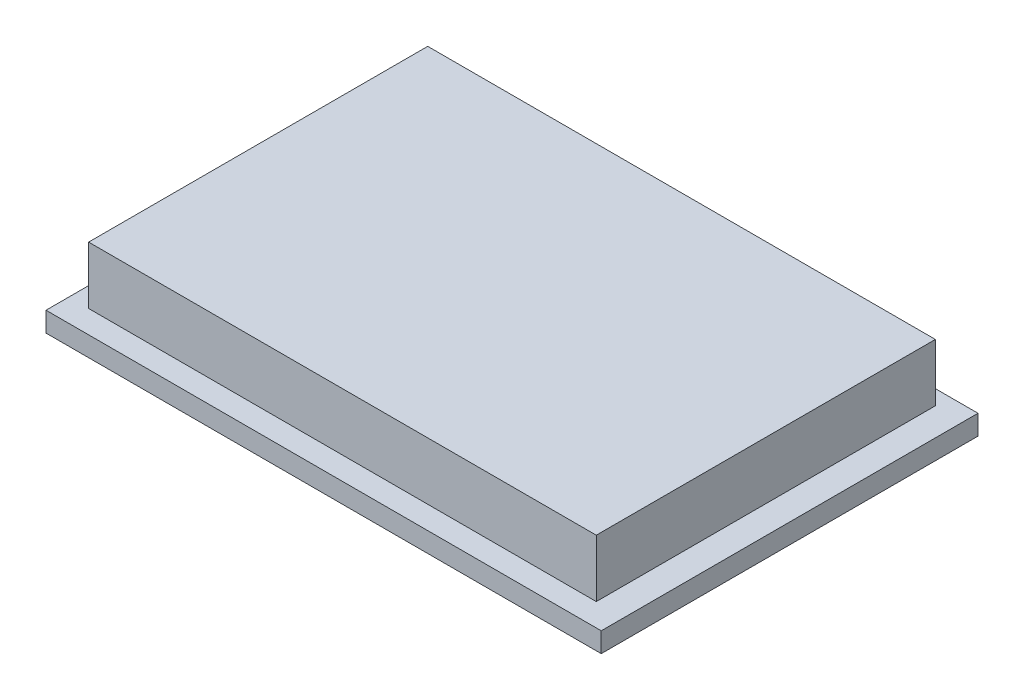
ISO-10303-21;
HEADER;
FILE_DESCRIPTION(('STEP AP214'),'2;1');
FILE_NAME('part.step','',(''),(''),'','','');
FILE_SCHEMA(('AUTOMOTIVE_DESIGN { 1 0 10303 214 1 1 1 1 }'));
ENDSEC;
DATA;
#1=APPLICATION_CONTEXT('core data for automotive mechanical design processes');
#2=APPLICATION_PROTOCOL_DEFINITION('international standard','automotive_design',2000,#1);
#3=PRODUCT_CONTEXT('',#1,'mechanical');
#4=PRODUCT('Part','Part','',(#3));
#5=PRODUCT_RELATED_PRODUCT_CATEGORY('part','',(#4));
#6=PRODUCT_DEFINITION_FORMATION('','',#4);
#7=PRODUCT_DEFINITION_CONTEXT('part definition',#1,'design');
#8=PRODUCT_DEFINITION('design','',#6,#7);
#9=PRODUCT_DEFINITION_SHAPE('','',#8);
#10=(LENGTH_UNIT() NAMED_UNIT(*) SI_UNIT(.MILLI.,.METRE.));
#11=(NAMED_UNIT(*) PLANE_ANGLE_UNIT() SI_UNIT($,.RADIAN.));
#12=(NAMED_UNIT(*) SI_UNIT($,.STERADIAN.) SOLID_ANGLE_UNIT());
#13=UNCERTAINTY_MEASURE_WITH_UNIT(LENGTH_MEASURE(1.E-05),#10,'distance_accuracy_value','');
#14=(GEOMETRIC_REPRESENTATION_CONTEXT(3) GLOBAL_UNCERTAINTY_ASSIGNED_CONTEXT((#13)) GLOBAL_UNIT_ASSIGNED_CONTEXT((#10,
#11,#12)) REPRESENTATION_CONTEXT('',''));
#15=CARTESIAN_POINT('',(0.,0.,0.));
#16=DIRECTION('',(0.,0.,1.));
#17=DIRECTION('',(1.,0.,0.));
#18=AXIS2_PLACEMENT_3D('',#15,#16,#17);
#19=CARTESIAN_POINT('',(-70.,-6.,-47.5));
#20=DIRECTION('',(1.,0.,0.));
#21=DIRECTION('',(0.,0.,-1.));
#22=AXIS2_PLACEMENT_3D('',#19,#20,#21);
#23=PLANE('',#22);
#24=DIRECTION('',(0.,0.,-1.));
#25=VECTOR('',#24,1.);
#26=CARTESIAN_POINT('',(-70.,-1.,-47.5));
#27=LINE('',#26,#25);
#28=CARTESIAN_POINT('',(-70.,-1.,47.5));
#29=VERTEX_POINT('',#28);
#30=CARTESIAN_POINT('',(-70.,-1.,-47.5));
#31=VERTEX_POINT('',#30);
#32=EDGE_CURVE('E106',#29,#31,#27,.T.);
#33=ORIENTED_EDGE('',*,*,#32,.T.);
#34=DIRECTION('',(0.,1.,0.));
#35=VECTOR('',#34,1.);
#36=CARTESIAN_POINT('',(-70.,-6.,-47.5));
#37=LINE('',#36,#35);
#38=CARTESIAN_POINT('',(-70.,-6.,-47.5));
#39=VERTEX_POINT('',#38);
#40=EDGE_CURVE('E12',#39,#31,#37,.T.);
#41=ORIENTED_EDGE('',*,*,#40,.F.);
#42=DIRECTION('',(0.,0.,-1.));
#43=VECTOR('',#42,1.);
#44=CARTESIAN_POINT('',(-70.,-6.,-47.5));
#45=LINE('',#44,#43);
#46=CARTESIAN_POINT('',(-70.,-6.,47.5));
#47=VERTEX_POINT('',#46);
#48=EDGE_CURVE('E94',#47,#39,#45,.T.);
#49=ORIENTED_EDGE('',*,*,#48,.F.);
#50=DIRECTION('',(0.,1.,0.));
#51=VECTOR('',#50,1.);
#52=CARTESIAN_POINT('',(-70.,-6.,47.5));
#53=LINE('',#52,#51);
#54=EDGE_CURVE('E102',#47,#29,#53,.T.);
#55=ORIENTED_EDGE('',*,*,#54,.T.);
#56=EDGE_LOOP('',(#33,#41,#49,#55));
#57=FACE_BOUND('',#56,.T.);
#58=ADVANCED_FACE('F43',(#57),#23,.F.);
#59=CARTESIAN_POINT('',(70.,-6.,-47.5));
#60=DIRECTION('',(0.,0.,1.));
#61=DIRECTION('',(1.,0.,0.));
#62=AXIS2_PLACEMENT_3D('',#59,#60,#61);
#63=PLANE('',#62);
#64=DIRECTION('',(1.,0.,0.));
#65=VECTOR('',#64,1.);
#66=CARTESIAN_POINT('',(70.,-1.,-47.5));
#67=LINE('',#66,#65);
#68=CARTESIAN_POINT('',(70.,-1.,-47.5));
#69=VERTEX_POINT('',#68);
#70=EDGE_CURVE('E98',#31,#69,#67,.T.);
#71=ORIENTED_EDGE('',*,*,#70,.T.);
#72=DIRECTION('',(0.,1.,0.));
#73=VECTOR('',#72,1.);
#74=CARTESIAN_POINT('',(70.,-6.,-47.5));
#75=LINE('',#74,#73);
#76=CARTESIAN_POINT('',(70.,-6.,-47.5));
#77=VERTEX_POINT('',#76);
#78=EDGE_CURVE('E51',#77,#69,#75,.T.);
#79=ORIENTED_EDGE('',*,*,#78,.F.);
#80=DIRECTION('',(1.,0.,0.));
#81=VECTOR('',#80,1.);
#82=CARTESIAN_POINT('',(70.,-6.,-47.5));
#83=LINE('',#82,#81);
#84=EDGE_CURVE('E89',#39,#77,#83,.T.);
#85=ORIENTED_EDGE('',*,*,#84,.F.);
#86=ORIENTED_EDGE('',*,*,#40,.T.);
#87=EDGE_LOOP('',(#71,#79,#85,#86));
#88=FACE_BOUND('',#87,.T.);
#89=ADVANCED_FACE('F97',(#88),#63,.F.);
#90=CARTESIAN_POINT('',(70.,-6.,-47.5));
#91=DIRECTION('',(-1.,0.,0.));
#92=DIRECTION('',(0.,0.,1.));
#93=AXIS2_PLACEMENT_3D('',#90,#91,#92);
#94=PLANE('',#93);
#95=DIRECTION('',(0.,0.,1.));
#96=VECTOR('',#95,1.);
#97=CARTESIAN_POINT('',(70.,-1.,-47.5));
#98=LINE('',#97,#96);
#99=CARTESIAN_POINT('',(70.,-1.,47.5));
#100=VERTEX_POINT('',#99);
#101=EDGE_CURVE('E76',#69,#100,#98,.T.);
#102=ORIENTED_EDGE('',*,*,#101,.T.);
#103=DIRECTION('',(0.,1.,0.));
#104=VECTOR('',#103,1.);
#105=CARTESIAN_POINT('',(70.,-6.,47.5));
#106=LINE('',#105,#104);
#107=CARTESIAN_POINT('',(70.,-6.,47.5));
#108=VERTEX_POINT('',#107);
#109=EDGE_CURVE('E99',#108,#100,#106,.T.);
#110=ORIENTED_EDGE('',*,*,#109,.F.);
#111=DIRECTION('',(0.,0.,1.));
#112=VECTOR('',#111,1.);
#113=CARTESIAN_POINT('',(70.,-6.,-47.5));
#114=LINE('',#113,#112);
#115=EDGE_CURVE('E92',#77,#108,#114,.T.);
#116=ORIENTED_EDGE('',*,*,#115,.F.);
#117=ORIENTED_EDGE('',*,*,#78,.T.);
#118=EDGE_LOOP('',(#102,#110,#116,#117));
#119=FACE_BOUND('',#118,.T.);
#120=ADVANCED_FACE('F100',(#119),#94,.F.);
#121=CARTESIAN_POINT('',(70.,-6.,47.5));
#122=DIRECTION('',(0.,0.,-1.));
#123=DIRECTION('',(-1.,0.,0.));
#124=AXIS2_PLACEMENT_3D('',#121,#122,#123);
#125=PLANE('',#124);
#126=DIRECTION('',(-1.,0.,0.));
#127=VECTOR('',#126,1.);
#128=CARTESIAN_POINT('',(70.,-1.,47.5));
#129=LINE('',#128,#127);
#130=EDGE_CURVE('E82',#100,#29,#129,.T.);
#131=ORIENTED_EDGE('',*,*,#130,.T.);
#132=ORIENTED_EDGE('',*,*,#54,.F.);
#133=DIRECTION('',(-1.,0.,0.));
#134=VECTOR('',#133,1.);
#135=CARTESIAN_POINT('',(70.,-6.,47.5));
#136=LINE('',#135,#134);
#137=EDGE_CURVE('E59',#108,#47,#136,.T.);
#138=ORIENTED_EDGE('',*,*,#137,.F.);
#139=ORIENTED_EDGE('',*,*,#109,.T.);
#140=EDGE_LOOP('',(#131,#132,#138,#139));
#141=FACE_BOUND('',#140,.T.);
#142=ADVANCED_FACE('F113',(#141),#125,.F.);
#143=CARTESIAN_POINT('',(-70.,-6.,47.5));
#144=DIRECTION('',(0.,-1.,0.));
#145=DIRECTION('',(0.,0.,-1.));
#146=AXIS2_PLACEMENT_3D('',#143,#144,#145);
#147=PLANE('',#146);
#148=ORIENTED_EDGE('',*,*,#48,.T.);
#149=ORIENTED_EDGE('',*,*,#84,.T.);
#150=ORIENTED_EDGE('',*,*,#115,.T.);
#151=ORIENTED_EDGE('',*,*,#137,.T.);
#152=EDGE_LOOP('',(#148,#149,#150,#151));
#153=FACE_BOUND('',#152,.T.);
#154=ADVANCED_FACE('F90',(#153),#147,.T.);
#155=CARTESIAN_POINT('',(-70.,-1.,47.5));
#156=DIRECTION('',(0.,-1.,0.));
#157=DIRECTION('',(0.,0.,-1.));
#158=AXIS2_PLACEMENT_3D('',#155,#156,#157);
#159=PLANE('',#158);
#160=ORIENTED_EDGE('',*,*,#32,.F.);
#161=ORIENTED_EDGE('',*,*,#130,.F.);
#162=ORIENTED_EDGE('',*,*,#101,.F.);
#163=ORIENTED_EDGE('',*,*,#70,.F.);
#164=EDGE_LOOP('',(#160,#161,#162,#163));
#165=FACE_BOUND('',#164,.T.);
#166=ADVANCED_FACE('F116',(#165),#159,.F.);
#167=CLOSED_SHELL('',(#58,#89,#120,#142,#154,#166));
#168=MANIFOLD_SOLID_BREP('B2',#167);
#169=CARTESIAN_POINT('',(64.,14.5,42.75));
#170=DIRECTION('',(-1.,0.,0.));
#171=DIRECTION('',(0.,0.,1.));
#172=AXIS2_PLACEMENT_3D('',#169,#170,#171);
#173=PLANE('',#172);
#174=DIRECTION('',(0.,0.,-1.));
#175=VECTOR('',#174,1.);
#176=CARTESIAN_POINT('',(64.,0.,42.75));
#177=LINE('',#176,#175);
#178=CARTESIAN_POINT('',(64.,0.,42.75));
#179=VERTEX_POINT('',#178);
#180=CARTESIAN_POINT('',(64.,0.,-42.75));
#181=VERTEX_POINT('',#180);
#182=EDGE_CURVE('E230',#179,#181,#177,.T.);
#183=ORIENTED_EDGE('',*,*,#182,.T.);
#184=DIRECTION('',(0.,-1.,0.));
#185=VECTOR('',#184,1.);
#186=CARTESIAN_POINT('',(64.,14.5,-42.75));
#187=LINE('',#186,#185);
#188=CARTESIAN_POINT('',(64.,14.5,-42.75));
#189=VERTEX_POINT('',#188);
#190=EDGE_CURVE('E41',#189,#181,#187,.T.);
#191=ORIENTED_EDGE('',*,*,#190,.F.);
#192=DIRECTION('',(0.,0.,-1.));
#193=VECTOR('',#192,1.);
#194=CARTESIAN_POINT('',(64.,14.5,42.75));
#195=LINE('',#194,#193);
#196=CARTESIAN_POINT('',(64.,14.5,42.75));
#197=VERTEX_POINT('',#196);
#198=EDGE_CURVE('E218',#197,#189,#195,.T.);
#199=ORIENTED_EDGE('',*,*,#198,.F.);
#200=DIRECTION('',(0.,-1.,0.));
#201=VECTOR('',#200,1.);
#202=CARTESIAN_POINT('',(64.,14.5,42.75));
#203=LINE('',#202,#201);
#204=EDGE_CURVE('E226',#197,#179,#203,.T.);
#205=ORIENTED_EDGE('',*,*,#204,.T.);
#206=EDGE_LOOP('',(#183,#191,#199,#205));
#207=FACE_BOUND('',#206,.T.);
#208=ADVANCED_FACE('F167',(#207),#173,.F.);
#209=CARTESIAN_POINT('',(-64.,14.5,-42.75));
#210=DIRECTION('',(0.,0.,1.));
#211=DIRECTION('',(1.,0.,0.));
#212=AXIS2_PLACEMENT_3D('',#209,#210,#211);
#213=PLANE('',#212);
#214=DIRECTION('',(-1.,0.,0.));
#215=VECTOR('',#214,1.);
#216=CARTESIAN_POINT('',(-64.,0.,-42.75));
#217=LINE('',#216,#215);
#218=CARTESIAN_POINT('',(-64.,0.,-42.75));
#219=VERTEX_POINT('',#218);
#220=EDGE_CURVE('E222',#181,#219,#217,.T.);
#221=ORIENTED_EDGE('',*,*,#220,.T.);
#222=DIRECTION('',(0.,-1.,0.));
#223=VECTOR('',#222,1.);
#224=CARTESIAN_POINT('',(-64.,14.5,-42.75));
#225=LINE('',#224,#223);
#226=CARTESIAN_POINT('',(-64.,14.5,-42.75));
#227=VERTEX_POINT('',#226);
#228=EDGE_CURVE('E175',#227,#219,#225,.T.);
#229=ORIENTED_EDGE('',*,*,#228,.F.);
#230=DIRECTION('',(-1.,0.,0.));
#231=VECTOR('',#230,1.);
#232=CARTESIAN_POINT('',(-64.,14.5,-42.75));
#233=LINE('',#232,#231);
#234=EDGE_CURVE('E213',#189,#227,#233,.T.);
#235=ORIENTED_EDGE('',*,*,#234,.F.);
#236=ORIENTED_EDGE('',*,*,#190,.T.);
#237=EDGE_LOOP('',(#221,#229,#235,#236));
#238=FACE_BOUND('',#237,.T.);
#239=ADVANCED_FACE('F221',(#238),#213,.F.);
#240=CARTESIAN_POINT('',(-64.,14.5,42.75));
#241=DIRECTION('',(1.,0.,0.));
#242=DIRECTION('',(0.,0.,-1.));
#243=AXIS2_PLACEMENT_3D('',#240,#241,#242);
#244=PLANE('',#243);
#245=DIRECTION('',(0.,0.,1.));
#246=VECTOR('',#245,1.);
#247=CARTESIAN_POINT('',(-64.,0.,42.75));
#248=LINE('',#247,#246);
#249=CARTESIAN_POINT('',(-64.,0.,42.75));
#250=VERTEX_POINT('',#249);
#251=EDGE_CURVE('E200',#219,#250,#248,.T.);
#252=ORIENTED_EDGE('',*,*,#251,.T.);
#253=DIRECTION('',(0.,-1.,0.));
#254=VECTOR('',#253,1.);
#255=CARTESIAN_POINT('',(-64.,14.5,42.75));
#256=LINE('',#255,#254);
#257=CARTESIAN_POINT('',(-64.,14.5,42.75));
#258=VERTEX_POINT('',#257);
#259=EDGE_CURVE('E223',#258,#250,#256,.T.);
#260=ORIENTED_EDGE('',*,*,#259,.F.);
#261=DIRECTION('',(0.,0.,1.));
#262=VECTOR('',#261,1.);
#263=CARTESIAN_POINT('',(-64.,14.5,42.75));
#264=LINE('',#263,#262);
#265=EDGE_CURVE('E216',#227,#258,#264,.T.);
#266=ORIENTED_EDGE('',*,*,#265,.F.);
#267=ORIENTED_EDGE('',*,*,#228,.T.);
#268=EDGE_LOOP('',(#252,#260,#266,#267));
#269=FACE_BOUND('',#268,.T.);
#270=ADVANCED_FACE('F224',(#269),#244,.F.);
#271=CARTESIAN_POINT('',(-64.,14.5,42.75));
#272=DIRECTION('',(0.,0.,-1.));
#273=DIRECTION('',(-1.,0.,0.));
#274=AXIS2_PLACEMENT_3D('',#271,#272,#273);
#275=PLANE('',#274);
#276=DIRECTION('',(1.,0.,0.));
#277=VECTOR('',#276,1.);
#278=CARTESIAN_POINT('',(-64.,0.,42.75));
#279=LINE('',#278,#277);
#280=EDGE_CURVE('E206',#250,#179,#279,.T.);
#281=ORIENTED_EDGE('',*,*,#280,.T.);
#282=ORIENTED_EDGE('',*,*,#204,.F.);
#283=DIRECTION('',(1.,0.,0.));
#284=VECTOR('',#283,1.);
#285=CARTESIAN_POINT('',(-64.,14.5,42.75));
#286=LINE('',#285,#284);
#287=EDGE_CURVE('E183',#258,#197,#286,.T.);
#288=ORIENTED_EDGE('',*,*,#287,.F.);
#289=ORIENTED_EDGE('',*,*,#259,.T.);
#290=EDGE_LOOP('',(#281,#282,#288,#289));
#291=FACE_BOUND('',#290,.T.);
#292=ADVANCED_FACE('F237',(#291),#275,.F.);
#293=CARTESIAN_POINT('',(64.,14.5,-42.75));
#294=DIRECTION('',(0.,-1.,0.));
#295=DIRECTION('',(0.,0.,-1.));
#296=AXIS2_PLACEMENT_3D('',#293,#294,#295);
#297=PLANE('',#296);
#298=ORIENTED_EDGE('',*,*,#198,.T.);
#299=ORIENTED_EDGE('',*,*,#234,.T.);
#300=ORIENTED_EDGE('',*,*,#265,.T.);
#301=ORIENTED_EDGE('',*,*,#287,.T.);
#302=EDGE_LOOP('',(#298,#299,#300,#301));
#303=FACE_BOUND('',#302,.T.);
#304=ADVANCED_FACE('F214',(#303),#297,.F.);
#305=CARTESIAN_POINT('',(64.,0.,-42.75));
#306=DIRECTION('',(0.,-1.,0.));
#307=DIRECTION('',(0.,0.,-1.));
#308=AXIS2_PLACEMENT_3D('',#305,#306,#307);
#309=PLANE('',#308);
#310=ORIENTED_EDGE('',*,*,#182,.F.);
#311=ORIENTED_EDGE('',*,*,#280,.F.);
#312=ORIENTED_EDGE('',*,*,#251,.F.);
#313=ORIENTED_EDGE('',*,*,#220,.F.);
#314=EDGE_LOOP('',(#310,#311,#312,#313));
#315=FACE_BOUND('',#314,.T.);
#316=ADVANCED_FACE('F240',(#315),#309,.T.);
#317=CLOSED_SHELL('',(#208,#239,#270,#292,#304,#316));
#318=MANIFOLD_SOLID_BREP('B6',#317);
#319=ADVANCED_BREP_SHAPE_REPRESENTATION('',(#18,#168,#318),#14);
#320=SHAPE_DEFINITION_REPRESENTATION(#9,#319);
ENDSEC;
END-ISO-10303-21;
